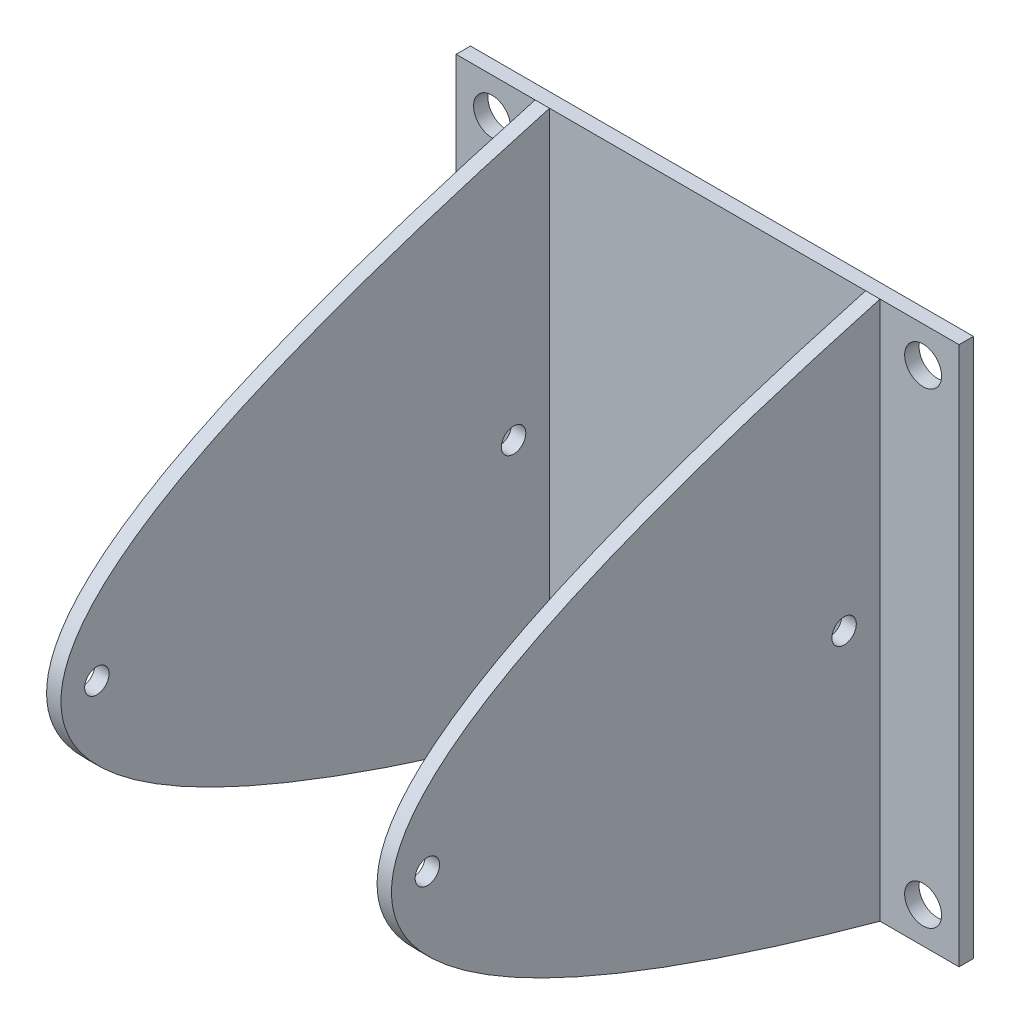
ISO-10303-21;
HEADER;
FILE_DESCRIPTION(('STEP AP214'),'2;1');
FILE_NAME('part.step','',(''),(''),'','','');
FILE_SCHEMA(('AUTOMOTIVE_DESIGN { 1 0 10303 214 1 1 1 1 }'));
ENDSEC;
DATA;
#1=APPLICATION_CONTEXT('core data for automotive mechanical design processes');
#2=APPLICATION_PROTOCOL_DEFINITION('international standard','automotive_design',2000,#1);
#3=PRODUCT_CONTEXT('',#1,'mechanical');
#4=PRODUCT('Part','Part','',(#3));
#5=PRODUCT_RELATED_PRODUCT_CATEGORY('part','',(#4));
#6=PRODUCT_DEFINITION_FORMATION('','',#4);
#7=PRODUCT_DEFINITION_CONTEXT('part definition',#1,'design');
#8=PRODUCT_DEFINITION('design','',#6,#7);
#9=PRODUCT_DEFINITION_SHAPE('','',#8);
#10=(LENGTH_UNIT() NAMED_UNIT(*) SI_UNIT(.MILLI.,.METRE.));
#11=(NAMED_UNIT(*) PLANE_ANGLE_UNIT() SI_UNIT($,.RADIAN.));
#12=(NAMED_UNIT(*) SI_UNIT($,.STERADIAN.) SOLID_ANGLE_UNIT());
#13=UNCERTAINTY_MEASURE_WITH_UNIT(LENGTH_MEASURE(1.E-05),#10,'distance_accuracy_value','');
#14=(GEOMETRIC_REPRESENTATION_CONTEXT(3) GLOBAL_UNCERTAINTY_ASSIGNED_CONTEXT((#13)) GLOBAL_UNIT_ASSIGNED_CONTEXT((#10,
#11,#12)) REPRESENTATION_CONTEXT('',''));
#15=CARTESIAN_POINT('',(0.,0.,0.));
#16=DIRECTION('',(0.,0.,1.));
#17=DIRECTION('',(1.,0.,0.));
#18=AXIS2_PLACEMENT_3D('',#15,#16,#17);
#19=CARTESIAN_POINT('',(0.,0.,2.54));
#20=DIRECTION('',(0.,0.,1.));
#21=DIRECTION('',(1.,0.,0.));
#22=AXIS2_PLACEMENT_3D('',#19,#20,#21);
#23=PLANE('',#22);
#24=CARTESIAN_POINT('',(-38.1,41.275,2.54));
#25=DIRECTION('',(0.,0.,1.));
#26=DIRECTION('',(1.,0.,0.));
#27=AXIS2_PLACEMENT_3D('',#24,#25,#26);
#28=CIRCLE('',#27,3.2639);
#29=CARTESIAN_POINT('',(-34.8361,41.275,2.54));
#30=VERTEX_POINT('',#29);
#31=EDGE_CURVE('E212',#30,#30,#28,.T.);
#32=ORIENTED_EDGE('',*,*,#31,.F.);
#33=EDGE_LOOP('',(#32));
#34=FACE_BOUND('',#33,.T.);
#35=CARTESIAN_POINT('',(-38.1,-41.275,2.54));
#36=DIRECTION('',(0.,0.,1.));
#37=DIRECTION('',(1.,0.,0.));
#38=AXIS2_PLACEMENT_3D('',#35,#36,#37);
#39=CIRCLE('',#38,3.2639);
#40=CARTESIAN_POINT('',(-34.8361,-41.275,2.54));
#41=VERTEX_POINT('',#40);
#42=EDGE_CURVE('E215',#41,#41,#39,.T.);
#43=ORIENTED_EDGE('',*,*,#42,.F.);
#44=EDGE_LOOP('',(#43));
#45=FACE_BOUND('',#44,.T.);
#46=DIRECTION('',(1.,0.,0.));
#47=VECTOR('',#46,1.);
#48=CARTESIAN_POINT('',(-44.45,-47.625,2.54));
#49=LINE('',#48,#47);
#50=CARTESIAN_POINT('',(-44.45,-47.625,2.54));
#51=VERTEX_POINT('',#50);
#52=CARTESIAN_POINT('',(-30.48,-47.625,2.54));
#53=VERTEX_POINT('',#52);
#54=EDGE_CURVE('E111',#51,#53,#49,.T.);
#55=ORIENTED_EDGE('',*,*,#54,.T.);
#56=DIRECTION('',(0.,1.,0.));
#57=VECTOR('',#56,1.);
#58=CARTESIAN_POINT('',(-30.48,47.625,2.54));
#59=LINE('',#58,#57);
#60=CARTESIAN_POINT('',(-30.48,47.625,2.54));
#61=VERTEX_POINT('',#60);
#62=EDGE_CURVE('E50',#53,#61,#59,.T.);
#63=ORIENTED_EDGE('',*,*,#62,.T.);
#64=DIRECTION('',(-1.,0.,0.));
#65=VECTOR('',#64,1.);
#66=CARTESIAN_POINT('',(-44.45,47.625,2.54));
#67=LINE('',#66,#65);
#68=CARTESIAN_POINT('',(-44.45,47.625,2.54));
#69=VERTEX_POINT('',#68);
#70=EDGE_CURVE('E299',#61,#69,#67,.T.);
#71=ORIENTED_EDGE('',*,*,#70,.T.);
#72=DIRECTION('',(0.,-1.,0.));
#73=VECTOR('',#72,1.);
#74=CARTESIAN_POINT('',(-44.45,47.625,2.54));
#75=LINE('',#74,#73);
#76=EDGE_CURVE('E217',#69,#51,#75,.T.);
#77=ORIENTED_EDGE('',*,*,#76,.T.);
#78=EDGE_LOOP('',(#55,#63,#71,#77));
#79=FACE_BOUND('',#78,.T.);
#80=ADVANCED_FACE('F35',(#34,#45,#79),#23,.T.);
#81=CARTESIAN_POINT('',(38.1,41.275,2.54));
#82=DIRECTION('',(0.,0.,1.));
#83=DIRECTION('',(1.,0.,0.));
#84=AXIS2_PLACEMENT_3D('',#81,#82,#83);
#85=CIRCLE('',#84,3.2639);
#86=CARTESIAN_POINT('',(41.3639,41.275,2.54));
#87=VERTEX_POINT('',#86);
#88=EDGE_CURVE('E274',#87,#87,#85,.T.);
#89=ORIENTED_EDGE('',*,*,#88,.F.);
#90=EDGE_LOOP('',(#89));
#91=FACE_BOUND('',#90,.T.);
#92=CARTESIAN_POINT('',(38.1,-41.275,2.54));
#93=DIRECTION('',(0.,0.,1.));
#94=DIRECTION('',(1.,0.,0.));
#95=AXIS2_PLACEMENT_3D('',#92,#93,#94);
#96=CIRCLE('',#95,3.2639);
#97=CARTESIAN_POINT('',(41.3639,-41.275,2.54));
#98=VERTEX_POINT('',#97);
#99=EDGE_CURVE('E286',#98,#98,#96,.T.);
#100=ORIENTED_EDGE('',*,*,#99,.F.);
#101=EDGE_LOOP('',(#100));
#102=FACE_BOUND('',#101,.T.);
#103=CARTESIAN_POINT('',(44.45,47.625,2.54));
#104=VERTEX_POINT('',#103);
#105=CARTESIAN_POINT('',(30.48,47.625,2.54));
#106=VERTEX_POINT('',#105);
#107=EDGE_CURVE('E301',#104,#106,#67,.T.);
#108=ORIENTED_EDGE('',*,*,#107,.T.);
#109=DIRECTION('',(0.,1.,0.));
#110=VECTOR('',#109,1.);
#111=CARTESIAN_POINT('',(30.48,47.625,2.54));
#112=LINE('',#111,#110);
#113=CARTESIAN_POINT('',(30.48,-47.625,2.54));
#114=VERTEX_POINT('',#113);
#115=EDGE_CURVE('E155',#114,#106,#112,.T.);
#116=ORIENTED_EDGE('',*,*,#115,.F.);
#117=CARTESIAN_POINT('',(44.45,-47.625,2.54));
#118=VERTEX_POINT('',#117);
#119=EDGE_CURVE('E112',#114,#118,#49,.T.);
#120=ORIENTED_EDGE('',*,*,#119,.T.);
#121=DIRECTION('',(0.,1.,0.));
#122=VECTOR('',#121,1.);
#123=CARTESIAN_POINT('',(44.45,47.625,2.54));
#124=LINE('',#123,#122);
#125=EDGE_CURVE('E296',#118,#104,#124,.T.);
#126=ORIENTED_EDGE('',*,*,#125,.T.);
#127=EDGE_LOOP('',(#108,#116,#120,#126));
#128=FACE_BOUND('',#127,.T.);
#129=ADVANCED_FACE('F188',(#91,#102,#128),#23,.T.);
#130=DIRECTION('',(0.,1.,0.));
#131=VECTOR('',#130,1.);
#132=CARTESIAN_POINT('',(-27.94,47.625,2.54));
#133=LINE('',#132,#131);
#134=CARTESIAN_POINT('',(-27.94,-47.625,2.54));
#135=VERTEX_POINT('',#134);
#136=CARTESIAN_POINT('',(-27.94,47.625,2.54));
#137=VERTEX_POINT('',#136);
#138=EDGE_CURVE('E115',#135,#137,#133,.T.);
#139=ORIENTED_EDGE('',*,*,#138,.F.);
#140=CARTESIAN_POINT('',(27.94,-47.625,2.54));
#141=VERTEX_POINT('',#140);
#142=EDGE_CURVE('E101',#135,#141,#49,.T.);
#143=ORIENTED_EDGE('',*,*,#142,.T.);
#144=DIRECTION('',(0.,1.,0.));
#145=VECTOR('',#144,1.);
#146=CARTESIAN_POINT('',(27.94,47.625,2.54));
#147=LINE('',#146,#145);
#148=CARTESIAN_POINT('',(27.94,47.625,2.54));
#149=VERTEX_POINT('',#148);
#150=EDGE_CURVE('E154',#141,#149,#147,.T.);
#151=ORIENTED_EDGE('',*,*,#150,.T.);
#152=EDGE_CURVE('E118',#149,#137,#67,.T.);
#153=ORIENTED_EDGE('',*,*,#152,.T.);
#154=EDGE_LOOP('',(#139,#143,#151,#153));
#155=FACE_BOUND('',#154,.T.);
#156=ADVANCED_FACE('F117',(#155),#23,.T.);
#157=CARTESIAN_POINT('',(0.,0.,0.));
#158=DIRECTION('',(0.,0.,1.));
#159=DIRECTION('',(1.,0.,0.));
#160=AXIS2_PLACEMENT_3D('',#157,#158,#159);
#161=PLANE('',#160);
#162=DIRECTION('',(0.,1.,0.));
#163=VECTOR('',#162,1.);
#164=CARTESIAN_POINT('',(44.45,47.625,0.));
#165=LINE('',#164,#163);
#166=CARTESIAN_POINT('',(44.45,-47.625,0.));
#167=VERTEX_POINT('',#166);
#168=CARTESIAN_POINT('',(44.45,47.625,0.));
#169=VERTEX_POINT('',#168);
#170=EDGE_CURVE('E293',#167,#169,#165,.T.);
#171=ORIENTED_EDGE('',*,*,#170,.F.);
#172=DIRECTION('',(1.,0.,0.));
#173=VECTOR('',#172,1.);
#174=CARTESIAN_POINT('',(-44.45,-47.625,0.));
#175=LINE('',#174,#173);
#176=CARTESIAN_POINT('',(-44.45,-47.625,0.));
#177=VERTEX_POINT('',#176);
#178=EDGE_CURVE('E300',#177,#167,#175,.T.);
#179=ORIENTED_EDGE('',*,*,#178,.F.);
#180=DIRECTION('',(0.,-1.,0.));
#181=VECTOR('',#180,1.);
#182=CARTESIAN_POINT('',(-44.45,47.625,0.));
#183=LINE('',#182,#181);
#184=CARTESIAN_POINT('',(-44.45,47.625,0.));
#185=VERTEX_POINT('',#184);
#186=EDGE_CURVE('E308',#185,#177,#183,.T.);
#187=ORIENTED_EDGE('',*,*,#186,.F.);
#188=DIRECTION('',(-1.,0.,0.));
#189=VECTOR('',#188,1.);
#190=CARTESIAN_POINT('',(-44.45,47.625,0.));
#191=LINE('',#190,#189);
#192=EDGE_CURVE('E306',#169,#185,#191,.T.);
#193=ORIENTED_EDGE('',*,*,#192,.F.);
#194=EDGE_LOOP('',(#171,#179,#187,#193));
#195=FACE_BOUND('',#194,.T.);
#196=CARTESIAN_POINT('',(-38.1,-41.275,0.));
#197=DIRECTION('',(0.,0.,1.));
#198=DIRECTION('',(1.,0.,0.));
#199=AXIS2_PLACEMENT_3D('',#196,#197,#198);
#200=CIRCLE('',#199,3.2639);
#201=CARTESIAN_POINT('',(-34.8361,-41.275,0.));
#202=VERTEX_POINT('',#201);
#203=EDGE_CURVE('E289',#202,#202,#200,.T.);
#204=ORIENTED_EDGE('',*,*,#203,.T.);
#205=EDGE_LOOP('',(#204));
#206=FACE_BOUND('',#205,.T.);
#207=CARTESIAN_POINT('',(38.1,-41.275,0.));
#208=DIRECTION('',(0.,0.,1.));
#209=DIRECTION('',(1.,0.,0.));
#210=AXIS2_PLACEMENT_3D('',#207,#208,#209);
#211=CIRCLE('',#210,3.2639);
#212=CARTESIAN_POINT('',(41.3639,-41.275,0.));
#213=VERTEX_POINT('',#212);
#214=EDGE_CURVE('E283',#213,#213,#211,.T.);
#215=ORIENTED_EDGE('',*,*,#214,.T.);
#216=EDGE_LOOP('',(#215));
#217=FACE_BOUND('',#216,.T.);
#218=CARTESIAN_POINT('',(-38.1,41.275,0.));
#219=DIRECTION('',(0.,0.,1.));
#220=DIRECTION('',(1.,0.,0.));
#221=AXIS2_PLACEMENT_3D('',#218,#219,#220);
#222=CIRCLE('',#221,3.2639);
#223=CARTESIAN_POINT('',(-34.8361,41.275,0.));
#224=VERTEX_POINT('',#223);
#225=EDGE_CURVE('E280',#224,#224,#222,.T.);
#226=ORIENTED_EDGE('',*,*,#225,.T.);
#227=EDGE_LOOP('',(#226));
#228=FACE_BOUND('',#227,.T.);
#229=CARTESIAN_POINT('',(38.1,41.275,0.));
#230=DIRECTION('',(0.,0.,1.));
#231=DIRECTION('',(1.,0.,0.));
#232=AXIS2_PLACEMENT_3D('',#229,#230,#231);
#233=CIRCLE('',#232,3.2639);
#234=CARTESIAN_POINT('',(41.3639,41.275,0.));
#235=VERTEX_POINT('',#234);
#236=EDGE_CURVE('E271',#235,#235,#233,.T.);
#237=ORIENTED_EDGE('',*,*,#236,.T.);
#238=EDGE_LOOP('',(#237));
#239=FACE_BOUND('',#238,.T.);
#240=ADVANCED_FACE('F187',(#195,#206,#217,#228,#239),#161,.F.);
#241=CARTESIAN_POINT('',(44.45,47.625,2.54));
#242=DIRECTION('',(-1.,0.,0.));
#243=DIRECTION('',(0.,-1.,0.));
#244=AXIS2_PLACEMENT_3D('',#241,#242,#243);
#245=PLANE('',#244);
#246=ORIENTED_EDGE('',*,*,#170,.T.);
#247=DIRECTION('',(0.,0.,-1.));
#248=VECTOR('',#247,1.);
#249=CARTESIAN_POINT('',(44.45,47.625,2.54));
#250=LINE('',#249,#248);
#251=EDGE_CURVE('E11',#104,#169,#250,.T.);
#252=ORIENTED_EDGE('',*,*,#251,.F.);
#253=ORIENTED_EDGE('',*,*,#125,.F.);
#254=DIRECTION('',(0.,0.,-1.));
#255=VECTOR('',#254,1.);
#256=CARTESIAN_POINT('',(44.45,-47.625,2.54));
#257=LINE('',#256,#255);
#258=EDGE_CURVE('E220',#118,#167,#257,.T.);
#259=ORIENTED_EDGE('',*,*,#258,.T.);
#260=EDGE_LOOP('',(#246,#252,#253,#259));
#261=FACE_BOUND('',#260,.T.);
#262=ADVANCED_FACE('F37',(#261),#245,.F.);
#263=CARTESIAN_POINT('',(-44.45,47.625,2.54));
#264=DIRECTION('',(0.,-1.,0.));
#265=DIRECTION('',(0.,0.,-1.));
#266=AXIS2_PLACEMENT_3D('',#263,#264,#265);
#267=PLANE('',#266);
#268=ORIENTED_EDGE('',*,*,#192,.T.);
#269=DIRECTION('',(0.,0.,-1.));
#270=VECTOR('',#269,1.);
#271=CARTESIAN_POINT('',(-44.45,47.625,2.54));
#272=LINE('',#271,#270);
#273=EDGE_CURVE('E43',#69,#185,#272,.T.);
#274=ORIENTED_EDGE('',*,*,#273,.F.);
#275=ORIENTED_EDGE('',*,*,#70,.F.);
#276=DIRECTION('',(-1.,0.,0.));
#277=VECTOR('',#276,1.);
#278=CARTESIAN_POINT('',(-27.94,47.625,2.54));
#279=LINE('',#278,#277);
#280=EDGE_CURVE('E57',#137,#61,#279,.T.);
#281=ORIENTED_EDGE('',*,*,#280,.F.);
#282=ORIENTED_EDGE('',*,*,#152,.F.);
#283=DIRECTION('',(1.,0.,0.));
#284=VECTOR('',#283,1.);
#285=CARTESIAN_POINT('',(27.94,47.625,2.54));
#286=LINE('',#285,#284);
#287=EDGE_CURVE('E268',#149,#106,#286,.T.);
#288=ORIENTED_EDGE('',*,*,#287,.T.);
#289=ORIENTED_EDGE('',*,*,#107,.F.);
#290=ORIENTED_EDGE('',*,*,#251,.T.);
#291=EDGE_LOOP('',(#268,#274,#275,#281,#282,#288,#289,#290));
#292=FACE_BOUND('',#291,.T.);
#293=ADVANCED_FACE('F196',(#292),#267,.F.);
#294=CARTESIAN_POINT('',(-44.45,47.625,2.54));
#295=DIRECTION('',(1.,0.,0.));
#296=DIRECTION('',(0.,1.,0.));
#297=AXIS2_PLACEMENT_3D('',#294,#295,#296);
#298=PLANE('',#297);
#299=ORIENTED_EDGE('',*,*,#186,.T.);
#300=DIRECTION('',(0.,0.,-1.));
#301=VECTOR('',#300,1.);
#302=CARTESIAN_POINT('',(-44.45,-47.625,2.54));
#303=LINE('',#302,#301);
#304=EDGE_CURVE('E313',#51,#177,#303,.T.);
#305=ORIENTED_EDGE('',*,*,#304,.F.);
#306=ORIENTED_EDGE('',*,*,#76,.F.);
#307=ORIENTED_EDGE('',*,*,#273,.T.);
#308=EDGE_LOOP('',(#299,#305,#306,#307));
#309=FACE_BOUND('',#308,.T.);
#310=ADVANCED_FACE('F194',(#309),#298,.F.);
#311=CARTESIAN_POINT('',(-44.45,-47.625,2.54));
#312=DIRECTION('',(0.,1.,0.));
#313=DIRECTION('',(0.,0.,1.));
#314=AXIS2_PLACEMENT_3D('',#311,#312,#313);
#315=PLANE('',#314);
#316=ORIENTED_EDGE('',*,*,#178,.T.);
#317=ORIENTED_EDGE('',*,*,#258,.F.);
#318=ORIENTED_EDGE('',*,*,#119,.F.);
#319=DIRECTION('',(1.,0.,0.));
#320=VECTOR('',#319,1.);
#321=CARTESIAN_POINT('',(27.94,-47.625,2.54));
#322=LINE('',#321,#320);
#323=EDGE_CURVE('E108',#141,#114,#322,.T.);
#324=ORIENTED_EDGE('',*,*,#323,.F.);
#325=ORIENTED_EDGE('',*,*,#142,.F.);
#326=DIRECTION('',(-1.,0.,0.));
#327=VECTOR('',#326,1.);
#328=CARTESIAN_POINT('',(-27.94,-47.625,2.54));
#329=LINE('',#328,#327);
#330=EDGE_CURVE('E106',#135,#53,#329,.T.);
#331=ORIENTED_EDGE('',*,*,#330,.T.);
#332=ORIENTED_EDGE('',*,*,#54,.F.);
#333=ORIENTED_EDGE('',*,*,#304,.T.);
#334=EDGE_LOOP('',(#316,#317,#318,#324,#325,#331,#332,#333));
#335=FACE_BOUND('',#334,.T.);
#336=ADVANCED_FACE('F103',(#335),#315,.F.);
#337=CARTESIAN_POINT('',(-38.1,-41.275,2.54));
#338=DIRECTION('',(0.,0.,-1.));
#339=DIRECTION('',(-1.,0.,0.));
#340=AXIS2_PLACEMENT_3D('',#337,#338,#339);
#341=CYLINDRICAL_SURFACE('',#340,3.2639);
#342=ORIENTED_EDGE('',*,*,#42,.T.);
#343=EDGE_LOOP('',(#342));
#344=FACE_BOUND('',#343,.T.);
#345=ORIENTED_EDGE('',*,*,#203,.F.);
#346=EDGE_LOOP('',(#345));
#347=FACE_BOUND('',#346,.T.);
#348=ADVANCED_FACE('F180',(#344,#347),#341,.F.);
#349=CARTESIAN_POINT('',(38.1,-41.275,2.54));
#350=DIRECTION('',(0.,0.,-1.));
#351=DIRECTION('',(-1.,0.,0.));
#352=AXIS2_PLACEMENT_3D('',#349,#350,#351);
#353=CYLINDRICAL_SURFACE('',#352,3.2639);
#354=ORIENTED_EDGE('',*,*,#99,.T.);
#355=EDGE_LOOP('',(#354));
#356=FACE_BOUND('',#355,.T.);
#357=ORIENTED_EDGE('',*,*,#214,.F.);
#358=EDGE_LOOP('',(#357));
#359=FACE_BOUND('',#358,.T.);
#360=ADVANCED_FACE('F176',(#356,#359),#353,.F.);
#361=CARTESIAN_POINT('',(-38.1,41.275,2.54));
#362=DIRECTION('',(0.,0.,-1.));
#363=DIRECTION('',(-1.,0.,0.));
#364=AXIS2_PLACEMENT_3D('',#361,#362,#363);
#365=CYLINDRICAL_SURFACE('',#364,3.2639);
#366=ORIENTED_EDGE('',*,*,#31,.T.);
#367=EDGE_LOOP('',(#366));
#368=FACE_BOUND('',#367,.T.);
#369=ORIENTED_EDGE('',*,*,#225,.F.);
#370=EDGE_LOOP('',(#369));
#371=FACE_BOUND('',#370,.T.);
#372=ADVANCED_FACE('F172',(#368,#371),#365,.F.);
#373=CARTESIAN_POINT('',(38.1,41.275,2.54));
#374=DIRECTION('',(0.,0.,-1.));
#375=DIRECTION('',(-1.,0.,0.));
#376=AXIS2_PLACEMENT_3D('',#373,#374,#375);
#377=CYLINDRICAL_SURFACE('',#376,3.2639);
#378=ORIENTED_EDGE('',*,*,#88,.T.);
#379=EDGE_LOOP('',(#378));
#380=FACE_BOUND('',#379,.T.);
#381=ORIENTED_EDGE('',*,*,#236,.F.);
#382=EDGE_LOOP('',(#381));
#383=FACE_BOUND('',#382,.T.);
#384=ADVANCED_FACE('F166',(#380,#383),#377,.F.);
#385=CARTESIAN_POINT('',(27.94,47.625,2.54));
#386=CARTESIAN_POINT('',(27.94,0.,175.26));
#387=CARTESIAN_POINT('',(27.94,-47.625,2.54));
#388=B_SPLINE_CURVE_WITH_KNOTS('',2,(#385,#386,#387),.UNSPECIFIED.,.F.,.F.,(3,3),(0.,1.),.UNSPECIFIED.);
#389=DIRECTION('',(1.,0.,0.));
#390=VECTOR('',#389,1.);
#391=SURFACE_OF_LINEAR_EXTRUSION('',#388,#390);
#392=CARTESIAN_POINT('',(30.48,47.625,2.54));
#393=CARTESIAN_POINT('',(30.48,0.,175.26));
#394=CARTESIAN_POINT('',(30.48,-47.625,2.54));
#395=B_SPLINE_CURVE_WITH_KNOTS('',2,(#392,#393,#394),.UNSPECIFIED.,.F.,.F.,(3,3),(0.,1.),.UNSPECIFIED.);
#396=EDGE_CURVE('E146',#106,#114,#395,.T.);
#397=ORIENTED_EDGE('',*,*,#396,.F.);
#398=ORIENTED_EDGE('',*,*,#287,.F.);
#399=EDGE_CURVE('E149',#149,#141,#388,.T.);
#400=ORIENTED_EDGE('',*,*,#399,.T.);
#401=ORIENTED_EDGE('',*,*,#323,.T.);
#402=EDGE_LOOP('',(#397,#398,#400,#401));
#403=FACE_BOUND('',#402,.T.);
#404=ADVANCED_FACE('F161',(#403),#391,.T.);
#405=CARTESIAN_POINT('',(27.94,0.,88.9));
#406=DIRECTION('',(-1.,0.,0.));
#407=DIRECTION('',(0.,0.,1.));
#408=AXIS2_PLACEMENT_3D('',#405,#406,#407);
#409=PLANE('',#408);
#410=CARTESIAN_POINT('',(27.94,0.,8.89));
#411=DIRECTION('',(1.,0.,0.));
#412=DIRECTION('',(0.,0.,-1.));
#413=AXIS2_PLACEMENT_3D('',#410,#411,#412);
#414=CIRCLE('',#413,2.159);
#415=CARTESIAN_POINT('',(27.94,0.,6.731));
#416=VERTEX_POINT('',#415);
#417=EDGE_CURVE('E134',#416,#416,#414,.T.);
#418=ORIENTED_EDGE('',*,*,#417,.T.);
#419=EDGE_LOOP('',(#418));
#420=FACE_BOUND('',#419,.T.);
#421=CARTESIAN_POINT('',(27.94,0.,82.55));
#422=DIRECTION('',(1.,0.,0.));
#423=DIRECTION('',(0.,0.,-1.));
#424=AXIS2_PLACEMENT_3D('',#421,#422,#423);
#425=CIRCLE('',#424,2.15899999999999);
#426=CARTESIAN_POINT('',(27.94,0.,80.391));
#427=VERTEX_POINT('',#426);
#428=EDGE_CURVE('E143',#427,#427,#425,.T.);
#429=ORIENTED_EDGE('',*,*,#428,.T.);
#430=EDGE_LOOP('',(#429));
#431=FACE_BOUND('',#430,.T.);
#432=ORIENTED_EDGE('',*,*,#399,.F.);
#433=ORIENTED_EDGE('',*,*,#150,.F.);
#434=EDGE_LOOP('',(#432,#433));
#435=FACE_BOUND('',#434,.T.);
#436=ADVANCED_FACE('F165',(#420,#431,#435),#409,.T.);
#437=CARTESIAN_POINT('',(30.48,0.,88.9));
#438=DIRECTION('',(-1.,0.,0.));
#439=DIRECTION('',(0.,0.,1.));
#440=AXIS2_PLACEMENT_3D('',#437,#438,#439);
#441=PLANE('',#440);
#442=CARTESIAN_POINT('',(30.48,0.,8.89));
#443=DIRECTION('',(1.,0.,0.));
#444=DIRECTION('',(0.,0.,-1.));
#445=AXIS2_PLACEMENT_3D('',#442,#443,#444);
#446=CIRCLE('',#445,2.159);
#447=CARTESIAN_POINT('',(30.48,0.,6.731));
#448=VERTEX_POINT('',#447);
#449=EDGE_CURVE('E131',#448,#448,#446,.T.);
#450=ORIENTED_EDGE('',*,*,#449,.F.);
#451=EDGE_LOOP('',(#450));
#452=FACE_BOUND('',#451,.T.);
#453=CARTESIAN_POINT('',(30.48,0.,82.55));
#454=DIRECTION('',(1.,0.,0.));
#455=DIRECTION('',(0.,0.,-1.));
#456=AXIS2_PLACEMENT_3D('',#453,#454,#455);
#457=CIRCLE('',#456,2.15899999999999);
#458=CARTESIAN_POINT('',(30.48,0.,80.391));
#459=VERTEX_POINT('',#458);
#460=EDGE_CURVE('E141',#459,#459,#457,.T.);
#461=ORIENTED_EDGE('',*,*,#460,.F.);
#462=EDGE_LOOP('',(#461));
#463=FACE_BOUND('',#462,.T.);
#464=ORIENTED_EDGE('',*,*,#396,.T.);
#465=ORIENTED_EDGE('',*,*,#115,.T.);
#466=EDGE_LOOP('',(#464,#465));
#467=FACE_BOUND('',#466,.T.);
#468=ADVANCED_FACE('F168',(#452,#463,#467),#441,.F.);
#469=CARTESIAN_POINT('',(27.94,0.,82.55));
#470=DIRECTION('',(1.,0.,0.));
#471=DIRECTION('',(0.,0.,-1.));
#472=AXIS2_PLACEMENT_3D('',#469,#470,#471);
#473=CYLINDRICAL_SURFACE('',#472,2.15899999999999);
#474=ORIENTED_EDGE('',*,*,#428,.F.);
#475=EDGE_LOOP('',(#474));
#476=FACE_BOUND('',#475,.T.);
#477=ORIENTED_EDGE('',*,*,#460,.T.);
#478=EDGE_LOOP('',(#477));
#479=FACE_BOUND('',#478,.T.);
#480=ADVANCED_FACE('F249',(#476,#479),#473,.F.);
#481=CARTESIAN_POINT('',(27.94,0.,8.89));
#482=DIRECTION('',(1.,0.,0.));
#483=DIRECTION('',(0.,0.,-1.));
#484=AXIS2_PLACEMENT_3D('',#481,#482,#483);
#485=CYLINDRICAL_SURFACE('',#484,2.159);
#486=ORIENTED_EDGE('',*,*,#417,.F.);
#487=EDGE_LOOP('',(#486));
#488=FACE_BOUND('',#487,.T.);
#489=ORIENTED_EDGE('',*,*,#449,.T.);
#490=EDGE_LOOP('',(#489));
#491=FACE_BOUND('',#490,.T.);
#492=ADVANCED_FACE('F246',(#488,#491),#485,.F.);
#493=CARTESIAN_POINT('',(-27.94,0.,88.9));
#494=DIRECTION('',(1.,0.,0.));
#495=DIRECTION('',(0.,0.,1.));
#496=AXIS2_PLACEMENT_3D('',#493,#494,#495);
#497=PLANE('',#496);
#498=CARTESIAN_POINT('',(-27.94,0.,82.55));
#499=DIRECTION('',(1.,0.,0.));
#500=DIRECTION('',(0.,0.,-1.));
#501=AXIS2_PLACEMENT_3D('',#498,#499,#500);
#502=CIRCLE('',#501,2.15899999999999);
#503=CARTESIAN_POINT('',(-27.94,0.,80.391));
#504=VERTEX_POINT('',#503);
#505=EDGE_CURVE('E224',#504,#504,#502,.T.);
#506=ORIENTED_EDGE('',*,*,#505,.F.);
#507=EDGE_LOOP('',(#506));
#508=FACE_BOUND('',#507,.T.);
#509=CARTESIAN_POINT('',(-27.94,47.625,2.54));
#510=CARTESIAN_POINT('',(-27.94,0.,175.26));
#511=CARTESIAN_POINT('',(-27.94,-47.625,2.54));
#512=B_SPLINE_CURVE_WITH_KNOTS('',2,(#509,#510,#511),.UNSPECIFIED.,.F.,.F.,(3,3),(0.,1.),.UNSPECIFIED.);
#513=EDGE_CURVE('E121',#137,#135,#512,.T.);
#514=ORIENTED_EDGE('',*,*,#513,.T.);
#515=ORIENTED_EDGE('',*,*,#138,.T.);
#516=EDGE_LOOP('',(#514,#515));
#517=FACE_BOUND('',#516,.T.);
#518=CARTESIAN_POINT('',(-27.94,0.,8.89));
#519=DIRECTION('',(1.,0.,0.));
#520=DIRECTION('',(0.,0.,-1.));
#521=AXIS2_PLACEMENT_3D('',#518,#519,#520);
#522=CIRCLE('',#521,2.159);
#523=CARTESIAN_POINT('',(-27.94,0.,6.731));
#524=VERTEX_POINT('',#523);
#525=EDGE_CURVE('E489',#524,#524,#522,.T.);
#526=ORIENTED_EDGE('',*,*,#525,.F.);
#527=EDGE_LOOP('',(#526));
#528=FACE_BOUND('',#527,.T.);
#529=ADVANCED_FACE('F123',(#508,#517,#528),#497,.T.);
#530=CARTESIAN_POINT('',(-30.48,0.,88.9));
#531=DIRECTION('',(1.,0.,0.));
#532=DIRECTION('',(0.,0.,1.));
#533=AXIS2_PLACEMENT_3D('',#530,#531,#532);
#534=PLANE('',#533);
#535=CARTESIAN_POINT('',(-30.48,47.625,2.54));
#536=CARTESIAN_POINT('',(-30.48,0.,175.26));
#537=CARTESIAN_POINT('',(-30.48,-47.625,2.54));
#538=B_SPLINE_CURVE_WITH_KNOTS('',2,(#535,#536,#537),.UNSPECIFIED.,.F.,.F.,(3,3),(0.,1.),.UNSPECIFIED.);
#539=EDGE_CURVE('E130',#61,#53,#538,.T.);
#540=ORIENTED_EDGE('',*,*,#539,.F.);
#541=ORIENTED_EDGE('',*,*,#62,.F.);
#542=EDGE_LOOP('',(#540,#541));
#543=FACE_BOUND('',#542,.T.);
#544=CARTESIAN_POINT('',(-30.48,0.,82.55));
#545=DIRECTION('',(1.,0.,0.));
#546=DIRECTION('',(0.,0.,-1.));
#547=AXIS2_PLACEMENT_3D('',#544,#545,#546);
#548=CIRCLE('',#547,2.15899999999999);
#549=CARTESIAN_POINT('',(-30.48,0.,80.391));
#550=VERTEX_POINT('',#549);
#551=EDGE_CURVE('E226',#550,#550,#548,.T.);
#552=ORIENTED_EDGE('',*,*,#551,.T.);
#553=EDGE_LOOP('',(#552));
#554=FACE_BOUND('',#553,.T.);
#555=CARTESIAN_POINT('',(-30.48,0.,8.89));
#556=DIRECTION('',(1.,0.,0.));
#557=DIRECTION('',(0.,0.,-1.));
#558=AXIS2_PLACEMENT_3D('',#555,#556,#557);
#559=CIRCLE('',#558,2.159);
#560=CARTESIAN_POINT('',(-30.48,0.,6.731));
#561=VERTEX_POINT('',#560);
#562=EDGE_CURVE('E492',#561,#561,#559,.T.);
#563=ORIENTED_EDGE('',*,*,#562,.T.);
#564=EDGE_LOOP('',(#563));
#565=FACE_BOUND('',#564,.T.);
#566=ADVANCED_FACE('F222',(#543,#554,#565),#534,.F.);
#567=DIRECTION('',(-1.,0.,0.));
#568=VECTOR('',#567,1.);
#569=SURFACE_OF_LINEAR_EXTRUSION('',#512,#568);
#570=ORIENTED_EDGE('',*,*,#539,.T.);
#571=ORIENTED_EDGE('',*,*,#330,.F.);
#572=ORIENTED_EDGE('',*,*,#513,.F.);
#573=ORIENTED_EDGE('',*,*,#280,.T.);
#574=EDGE_LOOP('',(#570,#571,#572,#573));
#575=FACE_BOUND('',#574,.T.);
#576=ADVANCED_FACE('F128',(#575),#569,.F.);
#577=CARTESIAN_POINT('',(-27.94,0.,82.55));
#578=DIRECTION('',(-1.,0.,0.));
#579=DIRECTION('',(0.,0.,1.));
#580=AXIS2_PLACEMENT_3D('',#577,#578,#579);
#581=CYLINDRICAL_SURFACE('',#580,2.15899999999999);
#582=ORIENTED_EDGE('',*,*,#505,.T.);
#583=EDGE_LOOP('',(#582));
#584=FACE_BOUND('',#583,.T.);
#585=ORIENTED_EDGE('',*,*,#551,.F.);
#586=EDGE_LOOP('',(#585));
#587=FACE_BOUND('',#586,.T.);
#588=ADVANCED_FACE('F244',(#584,#587),#581,.F.);
#589=CARTESIAN_POINT('',(-27.94,0.,8.89));
#590=DIRECTION('',(-1.,0.,0.));
#591=DIRECTION('',(0.,0.,1.));
#592=AXIS2_PLACEMENT_3D('',#589,#590,#591);
#593=CYLINDRICAL_SURFACE('',#592,2.159);
#594=ORIENTED_EDGE('',*,*,#525,.T.);
#595=EDGE_LOOP('',(#594));
#596=FACE_BOUND('',#595,.T.);
#597=ORIENTED_EDGE('',*,*,#562,.F.);
#598=EDGE_LOOP('',(#597));
#599=FACE_BOUND('',#598,.T.);
#600=ADVANCED_FACE('F382',(#596,#599),#593,.F.);
#601=CLOSED_SHELL('',(#80,#129,#156,#240,#262,#293,#310,#336,#348,#360,#372,#384,#404,#436,#468,
#480,#492,#529,#566,#576,#588,#600));
#602=MANIFOLD_SOLID_BREP('B2',#601);
#603=ADVANCED_BREP_SHAPE_REPRESENTATION('',(#18,#602),#14);
#604=SHAPE_DEFINITION_REPRESENTATION(#9,#603);
ENDSEC;
END-ISO-10303-21;
